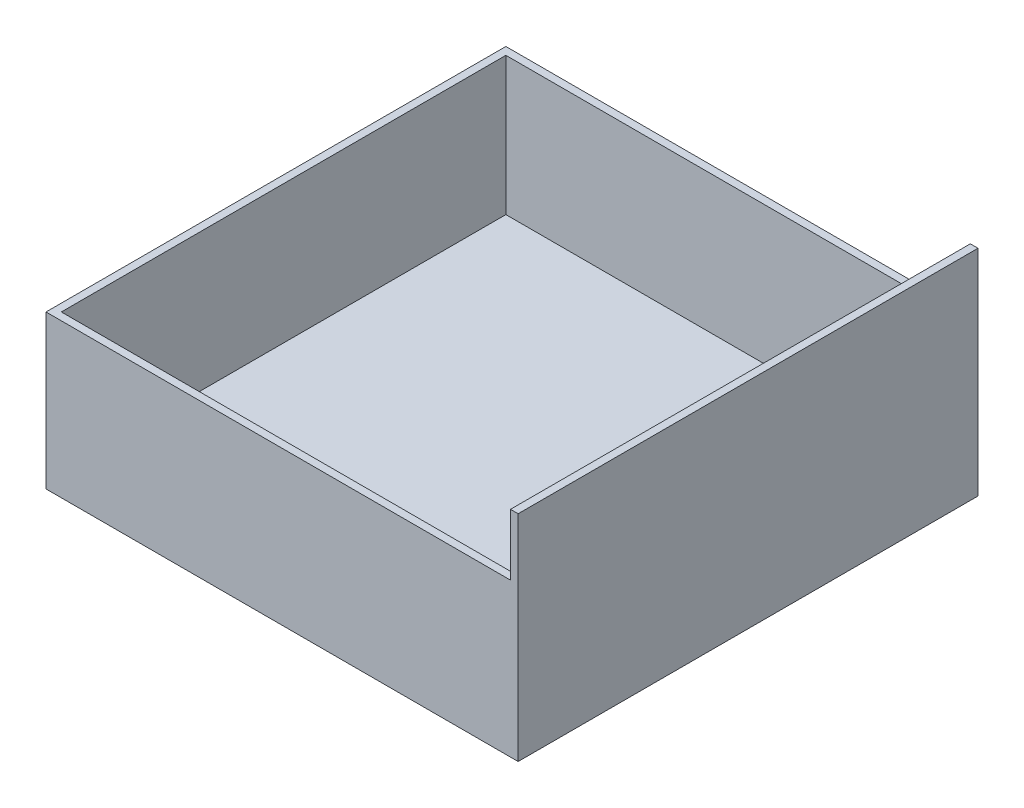
ISO-10303-21;
HEADER;
FILE_DESCRIPTION(('STEP AP214'),'2;1');
FILE_NAME('part.step','',(''),(''),'','','');
FILE_SCHEMA(('AUTOMOTIVE_DESIGN { 1 0 10303 214 1 1 1 1 }'));
ENDSEC;
DATA;
#1=APPLICATION_CONTEXT('core data for automotive mechanical design processes');
#2=APPLICATION_PROTOCOL_DEFINITION('international standard','automotive_design',2000,#1);
#3=PRODUCT_CONTEXT('',#1,'mechanical');
#4=PRODUCT('Part','Part','',(#3));
#5=PRODUCT_RELATED_PRODUCT_CATEGORY('part','',(#4));
#6=PRODUCT_DEFINITION_FORMATION('','',#4);
#7=PRODUCT_DEFINITION_CONTEXT('part definition',#1,'design');
#8=PRODUCT_DEFINITION('design','',#6,#7);
#9=PRODUCT_DEFINITION_SHAPE('','',#8);
#10=(LENGTH_UNIT() NAMED_UNIT(*) SI_UNIT(.MILLI.,.METRE.));
#11=(NAMED_UNIT(*) PLANE_ANGLE_UNIT() SI_UNIT($,.RADIAN.));
#12=(NAMED_UNIT(*) SI_UNIT($,.STERADIAN.) SOLID_ANGLE_UNIT());
#13=UNCERTAINTY_MEASURE_WITH_UNIT(LENGTH_MEASURE(1.E-05),#10,'distance_accuracy_value','');
#14=(GEOMETRIC_REPRESENTATION_CONTEXT(3) GLOBAL_UNCERTAINTY_ASSIGNED_CONTEXT((#13)) GLOBAL_UNIT_ASSIGNED_CONTEXT((#10,
#11,#12)) REPRESENTATION_CONTEXT('',''));
#15=CARTESIAN_POINT('',(0.,0.,0.));
#16=DIRECTION('',(0.,0.,1.));
#17=DIRECTION('',(1.,0.,0.));
#18=AXIS2_PLACEMENT_3D('',#15,#16,#17);
#19=CARTESIAN_POINT('',(0.,35.56,-38.1));
#20=DIRECTION('',(1.,0.,0.));
#21=DIRECTION('',(0.,0.,-1.));
#22=AXIS2_PLACEMENT_3D('',#19,#20,#21);
#23=PLANE('',#22);
#24=DIRECTION('',(0.,-1.,0.));
#25=VECTOR('',#24,1.);
#26=CARTESIAN_POINT('',(0.,35.56,38.1));
#27=LINE('',#26,#25);
#28=CARTESIAN_POINT('',(0.,25.4,38.1));
#29=VERTEX_POINT('',#28);
#30=CARTESIAN_POINT('',(0.,0.,38.1));
#31=VERTEX_POINT('',#30);
#32=EDGE_CURVE('E11',#29,#31,#27,.T.);
#33=ORIENTED_EDGE('',*,*,#32,.F.);
#34=DIRECTION('',(0.,0.,1.));
#35=VECTOR('',#34,1.);
#36=CARTESIAN_POINT('',(0.,25.4,-38.1));
#37=LINE('',#36,#35);
#38=CARTESIAN_POINT('',(0.,25.4,-38.1));
#39=VERTEX_POINT('',#38);
#40=EDGE_CURVE('E86',#39,#29,#37,.T.);
#41=ORIENTED_EDGE('',*,*,#40,.F.);
#42=DIRECTION('',(0.,-1.,0.));
#43=VECTOR('',#42,1.);
#44=CARTESIAN_POINT('',(0.,35.56,-38.1));
#45=LINE('',#44,#43);
#46=CARTESIAN_POINT('',(0.,0.,-38.1));
#47=VERTEX_POINT('',#46);
#48=EDGE_CURVE('E79',#39,#47,#45,.T.);
#49=ORIENTED_EDGE('',*,*,#48,.T.);
#50=DIRECTION('',(0.,0.,1.));
#51=VECTOR('',#50,1.);
#52=CARTESIAN_POINT('',(0.,0.,-38.1));
#53=LINE('',#52,#51);
#54=EDGE_CURVE('E83',#47,#31,#53,.T.);
#55=ORIENTED_EDGE('',*,*,#54,.T.);
#56=EDGE_LOOP('',(#33,#41,#49,#55));
#57=FACE_BOUND('',#56,.T.);
#58=ADVANCED_FACE('F37',(#57),#23,.F.);
#59=CARTESIAN_POINT('',(0.,35.56,38.1));
#60=DIRECTION('',(0.,0.,-1.));
#61=DIRECTION('',(-1.,0.,0.));
#62=AXIS2_PLACEMENT_3D('',#59,#60,#61);
#63=PLANE('',#62);
#64=DIRECTION('',(1.,0.,0.));
#65=VECTOR('',#64,1.);
#66=CARTESIAN_POINT('',(0.,35.56,38.1));
#67=LINE('',#66,#65);
#68=CARTESIAN_POINT('',(76.962,35.56,38.1));
#69=VERTEX_POINT('',#68);
#70=CARTESIAN_POINT('',(78.232,35.56,38.1));
#71=VERTEX_POINT('',#70);
#72=EDGE_CURVE('E99',#69,#71,#67,.T.);
#73=ORIENTED_EDGE('',*,*,#72,.F.);
#74=DIRECTION('',(0.,1.,0.));
#75=VECTOR('',#74,1.);
#76=CARTESIAN_POINT('',(76.962,25.4,38.1));
#77=LINE('',#76,#75);
#78=CARTESIAN_POINT('',(76.962,25.4,38.1));
#79=VERTEX_POINT('',#78);
#80=EDGE_CURVE('E184',#79,#69,#77,.T.);
#81=ORIENTED_EDGE('',*,*,#80,.F.);
#82=DIRECTION('',(1.,0.,0.));
#83=VECTOR('',#82,1.);
#84=CARTESIAN_POINT('',(0.,25.4,38.1));
#85=LINE('',#84,#83);
#86=EDGE_CURVE('E126',#29,#79,#85,.T.);
#87=ORIENTED_EDGE('',*,*,#86,.F.);
#88=ORIENTED_EDGE('',*,*,#32,.T.);
#89=DIRECTION('',(1.,0.,0.));
#90=VECTOR('',#89,1.);
#91=CARTESIAN_POINT('',(0.,0.,38.1));
#92=LINE('',#91,#90);
#93=CARTESIAN_POINT('',(78.232,0.,38.1));
#94=VERTEX_POINT('',#93);
#95=EDGE_CURVE('E104',#31,#94,#92,.T.);
#96=ORIENTED_EDGE('',*,*,#95,.T.);
#97=DIRECTION('',(0.,-1.,0.));
#98=VECTOR('',#97,1.);
#99=CARTESIAN_POINT('',(78.232,35.56,38.1));
#100=LINE('',#99,#98);
#101=EDGE_CURVE('E44',#71,#94,#100,.T.);
#102=ORIENTED_EDGE('',*,*,#101,.F.);
#103=EDGE_LOOP('',(#73,#81,#87,#88,#96,#102));
#104=FACE_BOUND('',#103,.T.);
#105=ADVANCED_FACE('F121',(#104),#63,.F.);
#106=CARTESIAN_POINT('',(78.232,35.56,-38.1));
#107=DIRECTION('',(-1.,0.,0.));
#108=DIRECTION('',(0.,0.,1.));
#109=AXIS2_PLACEMENT_3D('',#106,#107,#108);
#110=PLANE('',#109);
#111=DIRECTION('',(0.,0.,-1.));
#112=VECTOR('',#111,1.);
#113=CARTESIAN_POINT('',(78.232,0.,-38.1));
#114=LINE('',#113,#112);
#115=CARTESIAN_POINT('',(78.232,0.,-38.1));
#116=VERTEX_POINT('',#115);
#117=EDGE_CURVE('E100',#94,#116,#114,.T.);
#118=ORIENTED_EDGE('',*,*,#117,.T.);
#119=DIRECTION('',(0.,-1.,0.));
#120=VECTOR('',#119,1.);
#121=CARTESIAN_POINT('',(78.232,35.56,-38.1));
#122=LINE('',#121,#120);
#123=CARTESIAN_POINT('',(78.232,35.56,-38.1));
#124=VERTEX_POINT('',#123);
#125=EDGE_CURVE('E89',#124,#116,#122,.T.);
#126=ORIENTED_EDGE('',*,*,#125,.F.);
#127=DIRECTION('',(0.,0.,-1.));
#128=VECTOR('',#127,1.);
#129=CARTESIAN_POINT('',(78.232,35.56,-38.1));
#130=LINE('',#129,#128);
#131=EDGE_CURVE('E60',#71,#124,#130,.T.);
#132=ORIENTED_EDGE('',*,*,#131,.F.);
#133=ORIENTED_EDGE('',*,*,#101,.T.);
#134=EDGE_LOOP('',(#118,#126,#132,#133));
#135=FACE_BOUND('',#134,.T.);
#136=ADVANCED_FACE('F118',(#135),#110,.F.);
#137=CARTESIAN_POINT('',(0.,35.56,-38.1));
#138=DIRECTION('',(0.,0.,1.));
#139=DIRECTION('',(1.,0.,0.));
#140=AXIS2_PLACEMENT_3D('',#137,#138,#139);
#141=PLANE('',#140);
#142=DIRECTION('',(-1.,0.,0.));
#143=VECTOR('',#142,1.);
#144=CARTESIAN_POINT('',(76.962,25.4,-38.1));
#145=LINE('',#144,#143);
#146=CARTESIAN_POINT('',(76.962,25.4,-38.1));
#147=VERTEX_POINT('',#146);
#148=EDGE_CURVE('E194',#147,#39,#145,.T.);
#149=ORIENTED_EDGE('',*,*,#148,.F.);
#150=DIRECTION('',(0.,1.,0.));
#151=VECTOR('',#150,1.);
#152=CARTESIAN_POINT('',(76.962,25.4,-38.1));
#153=LINE('',#152,#151);
#154=CARTESIAN_POINT('',(76.962,35.56,-38.1));
#155=VERTEX_POINT('',#154);
#156=EDGE_CURVE('E193',#147,#155,#153,.T.);
#157=ORIENTED_EDGE('',*,*,#156,.T.);
#158=DIRECTION('',(-1.,0.,0.));
#159=VECTOR('',#158,1.);
#160=CARTESIAN_POINT('',(0.,35.56,-38.1));
#161=LINE('',#160,#159);
#162=EDGE_CURVE('E90',#124,#155,#161,.T.);
#163=ORIENTED_EDGE('',*,*,#162,.F.);
#164=ORIENTED_EDGE('',*,*,#125,.T.);
#165=DIRECTION('',(-1.,0.,0.));
#166=VECTOR('',#165,1.);
#167=CARTESIAN_POINT('',(0.,0.,-38.1));
#168=LINE('',#167,#166);
#169=EDGE_CURVE('E94',#116,#47,#168,.T.);
#170=ORIENTED_EDGE('',*,*,#169,.T.);
#171=ORIENTED_EDGE('',*,*,#48,.F.);
#172=EDGE_LOOP('',(#149,#157,#163,#164,#170,#171));
#173=FACE_BOUND('',#172,.T.);
#174=ADVANCED_FACE('F95',(#173),#141,.F.);
#175=CARTESIAN_POINT('',(0.,35.56,0.));
#176=DIRECTION('',(0.,1.,0.));
#177=DIRECTION('',(0.,0.,1.));
#178=AXIS2_PLACEMENT_3D('',#175,#176,#177);
#179=PLANE('',#178);
#180=DIRECTION('',(0.,0.,-1.));
#181=VECTOR('',#180,1.);
#182=CARTESIAN_POINT('',(76.962,35.56,-36.83));
#183=LINE('',#182,#181);
#184=EDGE_CURVE('E172',#69,#155,#183,.T.);
#185=ORIENTED_EDGE('',*,*,#184,.F.);
#186=ORIENTED_EDGE('',*,*,#72,.T.);
#187=ORIENTED_EDGE('',*,*,#131,.T.);
#188=ORIENTED_EDGE('',*,*,#162,.T.);
#189=EDGE_LOOP('',(#185,#186,#187,#188));
#190=FACE_BOUND('',#189,.T.);
#191=ADVANCED_FACE('F189',(#190),#179,.T.);
#192=CARTESIAN_POINT('',(0.,0.,0.));
#193=DIRECTION('',(0.,1.,0.));
#194=DIRECTION('',(0.,0.,1.));
#195=AXIS2_PLACEMENT_3D('',#192,#193,#194);
#196=PLANE('',#195);
#197=ORIENTED_EDGE('',*,*,#54,.F.);
#198=ORIENTED_EDGE('',*,*,#169,.F.);
#199=ORIENTED_EDGE('',*,*,#117,.F.);
#200=ORIENTED_EDGE('',*,*,#95,.F.);
#201=EDGE_LOOP('',(#197,#198,#199,#200));
#202=FACE_BOUND('',#201,.T.);
#203=ADVANCED_FACE('F103',(#202),#196,.F.);
#204=CARTESIAN_POINT('',(1.26999999999999,2.53999999999999,-36.83));
#205=DIRECTION('',(-1.,0.,0.));
#206=DIRECTION('',(0.,0.,1.));
#207=AXIS2_PLACEMENT_3D('',#204,#205,#206);
#208=PLANE('',#207);
#209=DIRECTION('',(0.,1.,0.));
#210=VECTOR('',#209,1.);
#211=CARTESIAN_POINT('',(1.26999999999999,2.53999999999999,-36.83));
#212=LINE('',#211,#210);
#213=CARTESIAN_POINT('',(1.26999999999999,2.53999999999999,-36.83));
#214=VERTEX_POINT('',#213);
#215=CARTESIAN_POINT('',(1.26999999999999,25.4,-36.83));
#216=VERTEX_POINT('',#215);
#217=EDGE_CURVE('E105',#214,#216,#212,.T.);
#218=ORIENTED_EDGE('',*,*,#217,.T.);
#219=DIRECTION('',(0.,0.,-1.));
#220=VECTOR('',#219,1.);
#221=CARTESIAN_POINT('',(1.27,25.4,36.83));
#222=LINE('',#221,#220);
#223=CARTESIAN_POINT('',(1.27,25.4,36.83));
#224=VERTEX_POINT('',#223);
#225=EDGE_CURVE('E212',#224,#216,#222,.T.);
#226=ORIENTED_EDGE('',*,*,#225,.F.);
#227=DIRECTION('',(0.,1.,0.));
#228=VECTOR('',#227,1.);
#229=CARTESIAN_POINT('',(1.27,2.53999999999999,36.83));
#230=LINE('',#229,#228);
#231=CARTESIAN_POINT('',(1.27,2.53999999999999,36.83));
#232=VERTEX_POINT('',#231);
#233=EDGE_CURVE('E167',#232,#224,#230,.T.);
#234=ORIENTED_EDGE('',*,*,#233,.F.);
#235=DIRECTION('',(0.,0.,1.));
#236=VECTOR('',#235,1.);
#237=CARTESIAN_POINT('',(1.26999999999999,2.53999999999999,-36.83));
#238=LINE('',#237,#236);
#239=EDGE_CURVE('E164',#214,#232,#238,.T.);
#240=ORIENTED_EDGE('',*,*,#239,.F.);
#241=EDGE_LOOP('',(#218,#226,#234,#240));
#242=FACE_BOUND('',#241,.T.);
#243=ADVANCED_FACE('F165',(#242),#208,.F.);
#244=CARTESIAN_POINT('',(1.26999999999999,2.53999999999999,-36.83));
#245=DIRECTION('',(0.,0.,-1.));
#246=DIRECTION('',(-1.,0.,0.));
#247=AXIS2_PLACEMENT_3D('',#244,#245,#246);
#248=PLANE('',#247);
#249=DIRECTION('',(0.,1.,0.));
#250=VECTOR('',#249,1.);
#251=CARTESIAN_POINT('',(76.962,2.53999999999999,-36.83));
#252=LINE('',#251,#250);
#253=CARTESIAN_POINT('',(76.962,2.53999999999999,-36.83));
#254=VERTEX_POINT('',#253);
#255=CARTESIAN_POINT('',(76.962,25.4,-36.83));
#256=VERTEX_POINT('',#255);
#257=EDGE_CURVE('E109',#254,#256,#252,.T.);
#258=ORIENTED_EDGE('',*,*,#257,.T.);
#259=DIRECTION('',(1.,0.,0.));
#260=VECTOR('',#259,1.);
#261=CARTESIAN_POINT('',(1.26999999999999,25.4,-36.83));
#262=LINE('',#261,#260);
#263=EDGE_CURVE('E160',#216,#256,#262,.T.);
#264=ORIENTED_EDGE('',*,*,#263,.F.);
#265=ORIENTED_EDGE('',*,*,#217,.F.);
#266=DIRECTION('',(-1.,0.,0.));
#267=VECTOR('',#266,1.);
#268=CARTESIAN_POINT('',(1.26999999999999,2.53999999999999,-36.83));
#269=LINE('',#268,#267);
#270=EDGE_CURVE('E157',#254,#214,#269,.T.);
#271=ORIENTED_EDGE('',*,*,#270,.F.);
#272=EDGE_LOOP('',(#258,#264,#265,#271));
#273=FACE_BOUND('',#272,.T.);
#274=ADVANCED_FACE('F155',(#273),#248,.F.);
#275=CARTESIAN_POINT('',(76.962,2.53999999999999,-36.83));
#276=DIRECTION('',(1.,0.,0.));
#277=DIRECTION('',(0.,0.,-1.));
#278=AXIS2_PLACEMENT_3D('',#275,#276,#277);
#279=PLANE('',#278);
#280=ORIENTED_EDGE('',*,*,#184,.T.);
#281=ORIENTED_EDGE('',*,*,#156,.F.);
#282=DIRECTION('',(0.,0.,-1.));
#283=VECTOR('',#282,1.);
#284=CARTESIAN_POINT('',(76.962,25.4,-36.83));
#285=LINE('',#284,#283);
#286=EDGE_CURVE('E206',#256,#147,#285,.T.);
#287=ORIENTED_EDGE('',*,*,#286,.F.);
#288=ORIENTED_EDGE('',*,*,#257,.F.);
#289=DIRECTION('',(0.,0.,-1.));
#290=VECTOR('',#289,1.);
#291=CARTESIAN_POINT('',(76.962,2.53999999999999,-36.83));
#292=LINE('',#291,#290);
#293=CARTESIAN_POINT('',(76.962,2.53999999999999,36.83));
#294=VERTEX_POINT('',#293);
#295=EDGE_CURVE('E177',#294,#254,#292,.T.);
#296=ORIENTED_EDGE('',*,*,#295,.F.);
#297=DIRECTION('',(0.,1.,0.));
#298=VECTOR('',#297,1.);
#299=CARTESIAN_POINT('',(76.962,2.53999999999999,36.83));
#300=LINE('',#299,#298);
#301=CARTESIAN_POINT('',(76.962,25.4,36.83));
#302=VERTEX_POINT('',#301);
#303=EDGE_CURVE('E179',#294,#302,#300,.T.);
#304=ORIENTED_EDGE('',*,*,#303,.T.);
#305=DIRECTION('',(0.,0.,-1.));
#306=VECTOR('',#305,1.);
#307=CARTESIAN_POINT('',(76.962,25.4,36.83));
#308=LINE('',#307,#306);
#309=EDGE_CURVE('E51',#79,#302,#308,.T.);
#310=ORIENTED_EDGE('',*,*,#309,.F.);
#311=ORIENTED_EDGE('',*,*,#80,.T.);
#312=EDGE_LOOP('',(#280,#281,#287,#288,#296,#304,#310,#311));
#313=FACE_BOUND('',#312,.T.);
#314=ADVANCED_FACE('F204',(#313),#279,.F.);
#315=CARTESIAN_POINT('',(1.27,2.53999999999999,36.83));
#316=DIRECTION('',(0.,0.,1.));
#317=DIRECTION('',(1.,0.,0.));
#318=AXIS2_PLACEMENT_3D('',#315,#316,#317);
#319=PLANE('',#318);
#320=ORIENTED_EDGE('',*,*,#233,.T.);
#321=DIRECTION('',(-1.,0.,0.));
#322=VECTOR('',#321,1.);
#323=CARTESIAN_POINT('',(76.962,25.4,36.83));
#324=LINE('',#323,#322);
#325=EDGE_CURVE('E203',#302,#224,#324,.T.);
#326=ORIENTED_EDGE('',*,*,#325,.F.);
#327=ORIENTED_EDGE('',*,*,#303,.F.);
#328=DIRECTION('',(1.,0.,0.));
#329=VECTOR('',#328,1.);
#330=CARTESIAN_POINT('',(1.27,2.53999999999999,36.83));
#331=LINE('',#330,#329);
#332=EDGE_CURVE('E171',#232,#294,#331,.T.);
#333=ORIENTED_EDGE('',*,*,#332,.F.);
#334=EDGE_LOOP('',(#320,#326,#327,#333));
#335=FACE_BOUND('',#334,.T.);
#336=ADVANCED_FACE('F202',(#335),#319,.F.);
#337=CARTESIAN_POINT('',(0.,2.53999999999999,0.));
#338=DIRECTION('',(0.,1.,0.));
#339=DIRECTION('',(0.,0.,1.));
#340=AXIS2_PLACEMENT_3D('',#337,#338,#339);
#341=PLANE('',#340);
#342=ORIENTED_EDGE('',*,*,#239,.T.);
#343=ORIENTED_EDGE('',*,*,#332,.T.);
#344=ORIENTED_EDGE('',*,*,#295,.T.);
#345=ORIENTED_EDGE('',*,*,#270,.T.);
#346=EDGE_LOOP('',(#342,#343,#344,#345));
#347=FACE_BOUND('',#346,.T.);
#348=ADVANCED_FACE('F175',(#347),#341,.T.);
#349=CARTESIAN_POINT('',(0.,25.4,0.));
#350=DIRECTION('',(0.,-1.,0.));
#351=DIRECTION('',(0.,0.,-1.));
#352=AXIS2_PLACEMENT_3D('',#349,#350,#351);
#353=PLANE('',#352);
#354=ORIENTED_EDGE('',*,*,#325,.T.);
#355=ORIENTED_EDGE('',*,*,#225,.T.);
#356=ORIENTED_EDGE('',*,*,#263,.T.);
#357=ORIENTED_EDGE('',*,*,#286,.T.);
#358=ORIENTED_EDGE('',*,*,#148,.T.);
#359=ORIENTED_EDGE('',*,*,#40,.T.);
#360=ORIENTED_EDGE('',*,*,#86,.T.);
#361=ORIENTED_EDGE('',*,*,#309,.T.);
#362=EDGE_LOOP('',(#354,#355,#356,#357,#358,#359,#360,#361));
#363=FACE_BOUND('',#362,.T.);
#364=ADVANCED_FACE('F211',(#363),#353,.F.);
#365=CLOSED_SHELL('',(#58,#105,#136,#174,#191,#203,#243,#274,#314,#336,#348,#364));
#366=MANIFOLD_SOLID_BREP('B2',#365);
#367=ADVANCED_BREP_SHAPE_REPRESENTATION('',(#18,#366),#14);
#368=SHAPE_DEFINITION_REPRESENTATION(#9,#367);
ENDSEC;
END-ISO-10303-21;
